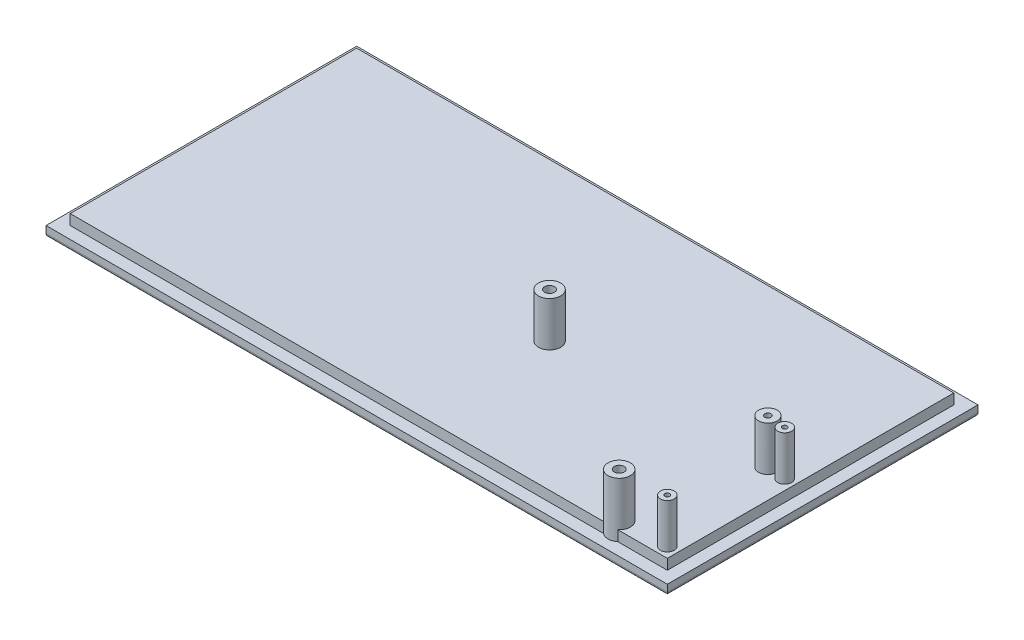
ISO-10303-21;
HEADER;
FILE_DESCRIPTION(('STEP AP214'),'2;1');
FILE_NAME('part.step','',(''),(''),'','','');
FILE_SCHEMA(('AUTOMOTIVE_DESIGN { 1 0 10303 214 1 1 1 1 }'));
ENDSEC;
DATA;
#1=APPLICATION_CONTEXT('core data for automotive mechanical design processes');
#2=APPLICATION_PROTOCOL_DEFINITION('international standard','automotive_design',2000,#1);
#3=PRODUCT_CONTEXT('',#1,'mechanical');
#4=PRODUCT('Part','Part','',(#3));
#5=PRODUCT_RELATED_PRODUCT_CATEGORY('part','',(#4));
#6=PRODUCT_DEFINITION_FORMATION('','',#4);
#7=PRODUCT_DEFINITION_CONTEXT('part definition',#1,'design');
#8=PRODUCT_DEFINITION('design','',#6,#7);
#9=PRODUCT_DEFINITION_SHAPE('','',#8);
#10=(LENGTH_UNIT() NAMED_UNIT(*) SI_UNIT(.MILLI.,.METRE.));
#11=(NAMED_UNIT(*) PLANE_ANGLE_UNIT() SI_UNIT($,.RADIAN.));
#12=(NAMED_UNIT(*) SI_UNIT($,.STERADIAN.) SOLID_ANGLE_UNIT());
#13=UNCERTAINTY_MEASURE_WITH_UNIT(LENGTH_MEASURE(1.E-05),#10,'distance_accuracy_value','');
#14=(GEOMETRIC_REPRESENTATION_CONTEXT(3) GLOBAL_UNCERTAINTY_ASSIGNED_CONTEXT((#13)) GLOBAL_UNIT_ASSIGNED_CONTEXT((#10,
#11,#12)) REPRESENTATION_CONTEXT('',''));
#15=CARTESIAN_POINT('',(0.,0.,0.));
#16=DIRECTION('',(0.,0.,1.));
#17=DIRECTION('',(1.,0.,0.));
#18=AXIS2_PLACEMENT_3D('',#15,#16,#17);
#19=CARTESIAN_POINT('',(-86.5,6.,41.5));
#20=DIRECTION('',(0.,0.,-1.));
#21=DIRECTION('',(-1.,0.,0.));
#22=AXIS2_PLACEMENT_3D('',#19,#20,#21);
#23=PLANE('',#22);
#24=DIRECTION('',(0.,-1.,0.));
#25=VECTOR('',#24,1.);
#26=CARTESIAN_POINT('',(72.1375777776576,28.0216781373065,41.5));
#27=LINE('',#26,#25);
#28=CARTESIAN_POINT('',(72.1375777776576,3.,41.5));
#29=VERTEX_POINT('',#28);
#30=CARTESIAN_POINT('',(72.1375777776576,6.,41.5));
#31=VERTEX_POINT('',#30);
#32=EDGE_CURVE('E56',#29,#31,#27,.F.);
#33=ORIENTED_EDGE('',*,*,#32,.F.);
#34=DIRECTION('',(1.,0.,0.));
#35=VECTOR('',#34,1.);
#36=CARTESIAN_POINT('',(-86.5,3.,41.5));
#37=LINE('',#36,#35);
#38=CARTESIAN_POINT('',(86.5,3.,41.5));
#39=VERTEX_POINT('',#38);
#40=EDGE_CURVE('E138',#29,#39,#37,.T.);
#41=ORIENTED_EDGE('',*,*,#40,.T.);
#42=DIRECTION('',(0.,-1.,0.));
#43=VECTOR('',#42,1.);
#44=CARTESIAN_POINT('',(86.5,6.,41.5));
#45=LINE('',#44,#43);
#46=CARTESIAN_POINT('',(86.5,6.,41.5));
#47=VERTEX_POINT('',#46);
#48=EDGE_CURVE('E172',#47,#39,#45,.T.);
#49=ORIENTED_EDGE('',*,*,#48,.F.);
#50=DIRECTION('',(1.,0.,0.));
#51=VECTOR('',#50,1.);
#52=CARTESIAN_POINT('',(-86.5,6.,41.5));
#53=LINE('',#52,#51);
#54=EDGE_CURVE('E140',#31,#47,#53,.T.);
#55=ORIENTED_EDGE('',*,*,#54,.F.);
#56=EDGE_LOOP('',(#33,#41,#49,#55));
#57=FACE_BOUND('',#56,.T.);
#58=ADVANCED_FACE('F41',(#57),#23,.F.);
#59=DIRECTION('',(0.,-1.,0.));
#60=VECTOR('',#59,1.);
#61=CARTESIAN_POINT('',(68.0264222223423,28.0216781373065,41.5));
#62=LINE('',#61,#60);
#63=CARTESIAN_POINT('',(68.0264222223423,6.,41.5));
#64=VERTEX_POINT('',#63);
#65=CARTESIAN_POINT('',(68.0264222223423,3.,41.5));
#66=VERTEX_POINT('',#65);
#67=EDGE_CURVE('E130',#64,#66,#62,.T.);
#68=ORIENTED_EDGE('',*,*,#67,.F.);
#69=CARTESIAN_POINT('',(-86.5,6.,41.5));
#70=VERTEX_POINT('',#69);
#71=EDGE_CURVE('E712',#70,#64,#53,.T.);
#72=ORIENTED_EDGE('',*,*,#71,.F.);
#73=DIRECTION('',(0.,-1.,0.));
#74=VECTOR('',#73,1.);
#75=CARTESIAN_POINT('',(-86.5,6.,41.5));
#76=LINE('',#75,#74);
#77=CARTESIAN_POINT('',(-86.5,3.,41.5));
#78=VERTEX_POINT('',#77);
#79=EDGE_CURVE('E163',#70,#78,#76,.T.);
#80=ORIENTED_EDGE('',*,*,#79,.T.);
#81=EDGE_CURVE('E63',#78,#66,#37,.T.);
#82=ORIENTED_EDGE('',*,*,#81,.T.);
#83=EDGE_LOOP('',(#68,#72,#80,#82));
#84=FACE_BOUND('',#83,.T.);
#85=ADVANCED_FACE('F279',(#84),#23,.F.);
#86=CARTESIAN_POINT('',(-90.,3.,-45.));
#87=DIRECTION('',(1.,0.,0.));
#88=DIRECTION('',(0.,0.,-1.));
#89=AXIS2_PLACEMENT_3D('',#86,#87,#88);
#90=PLANE('',#89);
#91=DIRECTION('',(0.,-1.,0.));
#92=VECTOR('',#91,1.);
#93=CARTESIAN_POINT('',(-90.,3.,-45.));
#94=LINE('',#93,#92);
#95=CARTESIAN_POINT('',(-90.,3.,-45.));
#96=VERTEX_POINT('',#95);
#97=CARTESIAN_POINT('',(-90.,1.,-45.));
#98=VERTEX_POINT('',#97);
#99=EDGE_CURVE('E185',#96,#98,#94,.T.);
#100=ORIENTED_EDGE('',*,*,#99,.T.);
#101=DIRECTION('',(0.,0.,1.));
#102=VECTOR('',#101,1.);
#103=CARTESIAN_POINT('',(-90.,1.,-45.));
#104=LINE('',#103,#102);
#105=CARTESIAN_POINT('',(-90.,1.,45.));
#106=VERTEX_POINT('',#105);
#107=EDGE_CURVE('E213',#98,#106,#104,.T.);
#108=ORIENTED_EDGE('',*,*,#107,.T.);
#109=DIRECTION('',(0.,-1.,0.));
#110=VECTOR('',#109,1.);
#111=CARTESIAN_POINT('',(-90.,3.,45.));
#112=LINE('',#111,#110);
#113=CARTESIAN_POINT('',(-90.,3.,45.));
#114=VERTEX_POINT('',#113);
#115=EDGE_CURVE('E194',#114,#106,#112,.T.);
#116=ORIENTED_EDGE('',*,*,#115,.F.);
#117=DIRECTION('',(0.,0.,1.));
#118=VECTOR('',#117,1.);
#119=CARTESIAN_POINT('',(-90.,3.,-45.));
#120=LINE('',#119,#118);
#121=EDGE_CURVE('E175',#96,#114,#120,.T.);
#122=ORIENTED_EDGE('',*,*,#121,.F.);
#123=EDGE_LOOP('',(#100,#108,#116,#122));
#124=FACE_BOUND('',#123,.T.);
#125=ADVANCED_FACE('F285',(#124),#90,.F.);
#126=CARTESIAN_POINT('',(-90.,3.,45.));
#127=DIRECTION('',(0.,0.,-1.));
#128=DIRECTION('',(-1.,0.,0.));
#129=AXIS2_PLACEMENT_3D('',#126,#127,#128);
#130=PLANE('',#129);
#131=ORIENTED_EDGE('',*,*,#115,.T.);
#132=DIRECTION('',(1.,0.,0.));
#133=VECTOR('',#132,1.);
#134=CARTESIAN_POINT('',(-90.,1.,45.));
#135=LINE('',#134,#133);
#136=CARTESIAN_POINT('',(90.,1.,45.));
#137=VERTEX_POINT('',#136);
#138=EDGE_CURVE('E197',#106,#137,#135,.T.);
#139=ORIENTED_EDGE('',*,*,#138,.T.);
#140=DIRECTION('',(0.,-1.,0.));
#141=VECTOR('',#140,1.);
#142=CARTESIAN_POINT('',(90.,3.,45.));
#143=LINE('',#142,#141);
#144=CARTESIAN_POINT('',(90.,3.,45.));
#145=VERTEX_POINT('',#144);
#146=EDGE_CURVE('E191',#145,#137,#143,.T.);
#147=ORIENTED_EDGE('',*,*,#146,.F.);
#148=DIRECTION('',(1.,0.,0.));
#149=VECTOR('',#148,1.);
#150=CARTESIAN_POINT('',(-90.,3.,45.));
#151=LINE('',#150,#149);
#152=EDGE_CURVE('E178',#114,#145,#151,.T.);
#153=ORIENTED_EDGE('',*,*,#152,.F.);
#154=EDGE_LOOP('',(#131,#139,#147,#153));
#155=FACE_BOUND('',#154,.T.);
#156=ADVANCED_FACE('F304',(#155),#130,.F.);
#157=CARTESIAN_POINT('',(90.,3.,-45.));
#158=DIRECTION('',(-1.,0.,0.));
#159=DIRECTION('',(0.,0.,1.));
#160=AXIS2_PLACEMENT_3D('',#157,#158,#159);
#161=PLANE('',#160);
#162=ORIENTED_EDGE('',*,*,#146,.T.);
#163=DIRECTION('',(0.,0.,-1.));
#164=VECTOR('',#163,1.);
#165=CARTESIAN_POINT('',(90.,1.,-45.));
#166=LINE('',#165,#164);
#167=CARTESIAN_POINT('',(90.,1.,-45.));
#168=VERTEX_POINT('',#167);
#169=EDGE_CURVE('E209',#137,#168,#166,.T.);
#170=ORIENTED_EDGE('',*,*,#169,.T.);
#171=DIRECTION('',(0.,-1.,0.));
#172=VECTOR('',#171,1.);
#173=CARTESIAN_POINT('',(90.,3.,-45.));
#174=LINE('',#173,#172);
#175=CARTESIAN_POINT('',(90.,3.,-45.));
#176=VERTEX_POINT('',#175);
#177=EDGE_CURVE('E188',#176,#168,#174,.T.);
#178=ORIENTED_EDGE('',*,*,#177,.F.);
#179=DIRECTION('',(0.,0.,-1.));
#180=VECTOR('',#179,1.);
#181=CARTESIAN_POINT('',(90.,3.,-45.));
#182=LINE('',#181,#180);
#183=EDGE_CURVE('E181',#145,#176,#182,.T.);
#184=ORIENTED_EDGE('',*,*,#183,.F.);
#185=EDGE_LOOP('',(#162,#170,#178,#184));
#186=FACE_BOUND('',#185,.T.);
#187=ADVANCED_FACE('F300',(#186),#161,.F.);
#188=CARTESIAN_POINT('',(-90.,3.,-45.));
#189=DIRECTION('',(0.,0.,1.));
#190=DIRECTION('',(1.,0.,0.));
#191=AXIS2_PLACEMENT_3D('',#188,#189,#190);
#192=PLANE('',#191);
#193=ORIENTED_EDGE('',*,*,#177,.T.);
#194=DIRECTION('',(-1.,0.,0.));
#195=VECTOR('',#194,1.);
#196=CARTESIAN_POINT('',(-90.,1.,-45.));
#197=LINE('',#196,#195);
#198=EDGE_CURVE('E211',#168,#98,#197,.T.);
#199=ORIENTED_EDGE('',*,*,#198,.T.);
#200=ORIENTED_EDGE('',*,*,#99,.F.);
#201=DIRECTION('',(-1.,0.,0.));
#202=VECTOR('',#201,1.);
#203=CARTESIAN_POINT('',(-90.,3.,-45.));
#204=LINE('',#203,#202);
#205=EDGE_CURVE('E183',#176,#96,#204,.T.);
#206=ORIENTED_EDGE('',*,*,#205,.F.);
#207=EDGE_LOOP('',(#193,#199,#200,#206));
#208=FACE_BOUND('',#207,.T.);
#209=ADVANCED_FACE('F294',(#208),#192,.F.);
#210=CARTESIAN_POINT('',(0.,3.,0.));
#211=DIRECTION('',(0.,1.,0.));
#212=DIRECTION('',(0.,0.,1.));
#213=AXIS2_PLACEMENT_3D('',#210,#211,#212);
#214=PLANE('',#213);
#215=ORIENTED_EDGE('',*,*,#40,.F.);
#216=CARTESIAN_POINT('',(70.082,3.,39.015));
#217=DIRECTION('',(0.,1.,0.));
#218=DIRECTION('',(0.,0.,1.));
#219=AXIS2_PLACEMENT_3D('',#216,#217,#218);
#220=CIRCLE('',#219,3.22500000000001);
#221=EDGE_CURVE('E127',#66,#29,#220,.T.);
#222=ORIENTED_EDGE('',*,*,#221,.F.);
#223=ORIENTED_EDGE('',*,*,#81,.F.);
#224=DIRECTION('',(0.,0.,1.));
#225=VECTOR('',#224,1.);
#226=CARTESIAN_POINT('',(-86.5,3.,-41.5));
#227=LINE('',#226,#225);
#228=CARTESIAN_POINT('',(-86.5,3.,-41.5));
#229=VERTEX_POINT('',#228);
#230=EDGE_CURVE('E161',#229,#78,#227,.T.);
#231=ORIENTED_EDGE('',*,*,#230,.F.);
#232=DIRECTION('',(-1.,0.,0.));
#233=VECTOR('',#232,1.);
#234=CARTESIAN_POINT('',(86.5,3.,-41.5));
#235=LINE('',#234,#233);
#236=CARTESIAN_POINT('',(86.5,3.,-41.5));
#237=VERTEX_POINT('',#236);
#238=EDGE_CURVE('E158',#237,#229,#235,.T.);
#239=ORIENTED_EDGE('',*,*,#238,.F.);
#240=DIRECTION('',(0.,0.,-1.));
#241=VECTOR('',#240,1.);
#242=CARTESIAN_POINT('',(86.5,3.,41.5));
#243=LINE('',#242,#241);
#244=EDGE_CURVE('E146',#39,#237,#243,.T.);
#245=ORIENTED_EDGE('',*,*,#244,.F.);
#246=EDGE_LOOP('',(#215,#222,#223,#231,#239,#245));
#247=FACE_BOUND('',#246,.T.);
#248=ORIENTED_EDGE('',*,*,#121,.T.);
#249=ORIENTED_EDGE('',*,*,#152,.T.);
#250=ORIENTED_EDGE('',*,*,#183,.T.);
#251=ORIENTED_EDGE('',*,*,#205,.T.);
#252=EDGE_LOOP('',(#248,#249,#250,#251));
#253=FACE_BOUND('',#252,.T.);
#254=ADVANCED_FACE('F143',(#247,#253),#214,.T.);
#255=CARTESIAN_POINT('',(0.,0.,0.));
#256=DIRECTION('',(0.,1.,0.));
#257=DIRECTION('',(0.,0.,1.));
#258=AXIS2_PLACEMENT_3D('',#255,#256,#257);
#259=PLANE('',#258);
#260=DIRECTION('',(0.,0.,-1.));
#261=VECTOR('',#260,1.);
#262=CARTESIAN_POINT('',(89.,0.,0.));
#263=LINE('',#262,#261);
#264=CARTESIAN_POINT('',(89.,0.,-44.));
#265=VERTEX_POINT('',#264);
#266=CARTESIAN_POINT('',(89.,0.,44.));
#267=VERTEX_POINT('',#266);
#268=EDGE_CURVE('E204',#265,#267,#263,.F.);
#269=ORIENTED_EDGE('',*,*,#268,.T.);
#270=DIRECTION('',(1.,0.,0.));
#271=VECTOR('',#270,1.);
#272=CARTESIAN_POINT('',(0.,0.,44.));
#273=LINE('',#272,#271);
#274=CARTESIAN_POINT('',(-89.,0.,44.));
#275=VERTEX_POINT('',#274);
#276=EDGE_CURVE('E206',#267,#275,#273,.F.);
#277=ORIENTED_EDGE('',*,*,#276,.T.);
#278=DIRECTION('',(0.,0.,1.));
#279=VECTOR('',#278,1.);
#280=CARTESIAN_POINT('',(-89.,0.,0.));
#281=LINE('',#280,#279);
#282=CARTESIAN_POINT('',(-89.,0.,-44.));
#283=VERTEX_POINT('',#282);
#284=EDGE_CURVE('E200',#275,#283,#281,.F.);
#285=ORIENTED_EDGE('',*,*,#284,.T.);
#286=DIRECTION('',(-1.,0.,0.));
#287=VECTOR('',#286,1.);
#288=CARTESIAN_POINT('',(0.,0.,-44.));
#289=LINE('',#288,#287);
#290=EDGE_CURVE('E202',#283,#265,#289,.F.);
#291=ORIENTED_EDGE('',*,*,#290,.T.);
#292=EDGE_LOOP('',(#269,#277,#285,#291));
#293=FACE_BOUND('',#292,.T.);
#294=ADVANCED_FACE('F293',(#293),#259,.F.);
#295=CARTESIAN_POINT('',(-90.,1.,-44.));
#296=DIRECTION('',(-1.,0.,0.));
#297=DIRECTION('',(0.,0.,1.));
#298=AXIS2_PLACEMENT_3D('',#295,#296,#297);
#299=CYLINDRICAL_SURFACE('',#298,1.);
#300=CARTESIAN_POINT('',(89.,1.,-44.));
#301=DIRECTION('',(-0.707106781186548,0.,-0.707106781186547));
#302=DIRECTION('',(-0.707106781186547,0.,0.707106781186548));
#303=AXIS2_PLACEMENT_3D('',#300,#301,#302);
#304=ELLIPSE('',#303,1.41421356237309,1.);
#305=EDGE_CURVE('E219',#265,#168,#304,.F.);
#306=ORIENTED_EDGE('',*,*,#305,.F.);
#307=ORIENTED_EDGE('',*,*,#290,.F.);
#308=CARTESIAN_POINT('',(-89.,1.,-44.));
#309=DIRECTION('',(-0.707106781186547,0.,0.707106781186548));
#310=DIRECTION('',(0.707106781186548,0.,0.707106781186547));
#311=AXIS2_PLACEMENT_3D('',#308,#309,#310);
#312=ELLIPSE('',#311,1.4142135623731,1.);
#313=EDGE_CURVE('E179',#98,#283,#312,.T.);
#314=ORIENTED_EDGE('',*,*,#313,.F.);
#315=ORIENTED_EDGE('',*,*,#198,.F.);
#316=EDGE_LOOP('',(#306,#307,#314,#315));
#317=FACE_BOUND('',#316,.T.);
#318=ADVANCED_FACE('F43',(#317),#299,.T.);
#319=CARTESIAN_POINT('',(-89.,1.,-45.));
#320=DIRECTION('',(0.,0.,1.));
#321=DIRECTION('',(1.,0.,0.));
#322=AXIS2_PLACEMENT_3D('',#319,#320,#321);
#323=CYLINDRICAL_SURFACE('',#322,1.);
#324=ORIENTED_EDGE('',*,*,#313,.T.);
#325=ORIENTED_EDGE('',*,*,#284,.F.);
#326=CARTESIAN_POINT('',(-89.,1.,44.));
#327=DIRECTION('',(0.707106781186548,0.,0.707106781186547));
#328=DIRECTION('',(-0.707106781186547,0.,0.707106781186548));
#329=AXIS2_PLACEMENT_3D('',#326,#327,#328);
#330=ELLIPSE('',#329,1.41421356237309,1.);
#331=EDGE_CURVE('E217',#106,#275,#330,.T.);
#332=ORIENTED_EDGE('',*,*,#331,.F.);
#333=ORIENTED_EDGE('',*,*,#107,.F.);
#334=EDGE_LOOP('',(#324,#325,#332,#333));
#335=FACE_BOUND('',#334,.T.);
#336=ADVANCED_FACE('F318',(#335),#323,.T.);
#337=CARTESIAN_POINT('',(89.,1.,-45.));
#338=DIRECTION('',(0.,0.,-1.));
#339=DIRECTION('',(-1.,0.,0.));
#340=AXIS2_PLACEMENT_3D('',#337,#338,#339);
#341=CYLINDRICAL_SURFACE('',#340,1.);
#342=ORIENTED_EDGE('',*,*,#305,.T.);
#343=ORIENTED_EDGE('',*,*,#169,.F.);
#344=CARTESIAN_POINT('',(89.,1.,44.));
#345=DIRECTION('',(0.707106781186547,0.,-0.707106781186548));
#346=DIRECTION('',(-0.707106781186548,0.,-0.707106781186547));
#347=AXIS2_PLACEMENT_3D('',#344,#345,#346);
#348=ELLIPSE('',#347,1.4142135623731,1.);
#349=EDGE_CURVE('E174',#267,#137,#348,.F.);
#350=ORIENTED_EDGE('',*,*,#349,.F.);
#351=ORIENTED_EDGE('',*,*,#268,.F.);
#352=EDGE_LOOP('',(#342,#343,#350,#351));
#353=FACE_BOUND('',#352,.T.);
#354=ADVANCED_FACE('F315',(#353),#341,.T.);
#355=CARTESIAN_POINT('',(-90.,1.,44.));
#356=DIRECTION('',(1.,0.,0.));
#357=DIRECTION('',(0.,0.,-1.));
#358=AXIS2_PLACEMENT_3D('',#355,#356,#357);
#359=CYLINDRICAL_SURFACE('',#358,1.);
#360=ORIENTED_EDGE('',*,*,#331,.T.);
#361=ORIENTED_EDGE('',*,*,#276,.F.);
#362=ORIENTED_EDGE('',*,*,#349,.T.);
#363=ORIENTED_EDGE('',*,*,#138,.F.);
#364=EDGE_LOOP('',(#360,#361,#362,#363));
#365=FACE_BOUND('',#364,.T.);
#366=ADVANCED_FACE('F312',(#365),#359,.T.);
#367=CARTESIAN_POINT('',(86.5,6.,41.5));
#368=DIRECTION('',(-1.,0.,0.));
#369=DIRECTION('',(0.,0.,1.));
#370=AXIS2_PLACEMENT_3D('',#367,#368,#369);
#371=PLANE('',#370);
#372=ORIENTED_EDGE('',*,*,#244,.T.);
#373=DIRECTION('',(0.,-1.,0.));
#374=VECTOR('',#373,1.);
#375=CARTESIAN_POINT('',(86.5,6.,-41.5));
#376=LINE('',#375,#374);
#377=CARTESIAN_POINT('',(86.5,6.,-41.5));
#378=VERTEX_POINT('',#377);
#379=EDGE_CURVE('E169',#378,#237,#376,.T.);
#380=ORIENTED_EDGE('',*,*,#379,.F.);
#381=DIRECTION('',(0.,0.,-1.));
#382=VECTOR('',#381,1.);
#383=CARTESIAN_POINT('',(86.5,6.,41.5));
#384=LINE('',#383,#382);
#385=EDGE_CURVE('E715',#47,#378,#384,.T.);
#386=ORIENTED_EDGE('',*,*,#385,.F.);
#387=ORIENTED_EDGE('',*,*,#48,.T.);
#388=EDGE_LOOP('',(#372,#380,#386,#387));
#389=FACE_BOUND('',#388,.T.);
#390=ADVANCED_FACE('F289',(#389),#371,.F.);
#391=CARTESIAN_POINT('',(86.5,6.,-41.5));
#392=DIRECTION('',(0.,0.,1.));
#393=DIRECTION('',(1.,0.,0.));
#394=AXIS2_PLACEMENT_3D('',#391,#392,#393);
#395=PLANE('',#394);
#396=ORIENTED_EDGE('',*,*,#238,.T.);
#397=DIRECTION('',(0.,-1.,0.));
#398=VECTOR('',#397,1.);
#399=CARTESIAN_POINT('',(-86.5,6.,-41.5));
#400=LINE('',#399,#398);
#401=CARTESIAN_POINT('',(-86.5,6.,-41.5));
#402=VERTEX_POINT('',#401);
#403=EDGE_CURVE('E166',#402,#229,#400,.T.);
#404=ORIENTED_EDGE('',*,*,#403,.F.);
#405=DIRECTION('',(-1.,0.,0.));
#406=VECTOR('',#405,1.);
#407=CARTESIAN_POINT('',(86.5,6.,-41.5));
#408=LINE('',#407,#406);
#409=EDGE_CURVE('E716',#378,#402,#408,.T.);
#410=ORIENTED_EDGE('',*,*,#409,.F.);
#411=ORIENTED_EDGE('',*,*,#379,.T.);
#412=EDGE_LOOP('',(#396,#404,#410,#411));
#413=FACE_BOUND('',#412,.T.);
#414=ADVANCED_FACE('F423',(#413),#395,.F.);
#415=CARTESIAN_POINT('',(-86.5,6.,-41.5));
#416=DIRECTION('',(1.,0.,0.));
#417=DIRECTION('',(0.,0.,-1.));
#418=AXIS2_PLACEMENT_3D('',#415,#416,#417);
#419=PLANE('',#418);
#420=ORIENTED_EDGE('',*,*,#230,.T.);
#421=ORIENTED_EDGE('',*,*,#79,.F.);
#422=DIRECTION('',(0.,0.,1.));
#423=VECTOR('',#422,1.);
#424=CARTESIAN_POINT('',(-86.5,6.,-41.5));
#425=LINE('',#424,#423);
#426=EDGE_CURVE('E155',#402,#70,#425,.T.);
#427=ORIENTED_EDGE('',*,*,#426,.F.);
#428=ORIENTED_EDGE('',*,*,#403,.T.);
#429=EDGE_LOOP('',(#420,#421,#427,#428));
#430=FACE_BOUND('',#429,.T.);
#431=ADVANCED_FACE('F275',(#430),#419,.F.);
#432=CARTESIAN_POINT('',(0.,6.,0.));
#433=DIRECTION('',(0.,1.,0.));
#434=DIRECTION('',(0.,0.,1.));
#435=AXIS2_PLACEMENT_3D('',#432,#433,#434);
#436=PLANE('',#435);
#437=CARTESIAN_POINT('',(14.882,6.,4.00499999999996));
#438=DIRECTION('',(0.,1.,0.));
#439=DIRECTION('',(0.,0.,1.));
#440=AXIS2_PLACEMENT_3D('',#437,#438,#439);
#441=CIRCLE('',#440,3.225);
#442=CARTESIAN_POINT('',(14.882,6.,7.22999999999996));
#443=VERTEX_POINT('',#442);
#444=EDGE_CURVE('E245',#443,#443,#441,.F.);
#445=ORIENTED_EDGE('',*,*,#444,.T.);
#446=EDGE_LOOP('',(#445));
#447=FACE_BOUND('',#446,.T.);
#448=CARTESIAN_POINT('',(78.142,6.,4.00499999999997));
#449=DIRECTION('',(0.,1.,0.));
#450=DIRECTION('',(0.,0.,1.));
#451=AXIS2_PLACEMENT_3D('',#448,#449,#450);
#452=CIRCLE('',#451,2.69499999999999);
#453=CARTESIAN_POINT('',(78.142,6.,6.69999999999996));
#454=VERTEX_POINT('',#453);
#455=EDGE_CURVE('E238',#454,#454,#452,.F.);
#456=ORIENTED_EDGE('',*,*,#455,.T.);
#457=EDGE_LOOP('',(#456));
#458=FACE_BOUND('',#457,.T.);
#459=CARTESIAN_POINT('',(83.5,6.,38.5));
#460=DIRECTION('',(0.,1.,0.));
#461=DIRECTION('',(0.,0.,1.));
#462=AXIS2_PLACEMENT_3D('',#459,#460,#461);
#463=CIRCLE('',#462,2.);
#464=CARTESIAN_POINT('',(83.5,6.,40.5));
#465=VERTEX_POINT('',#464);
#466=EDGE_CURVE('E230',#465,#465,#463,.F.);
#467=ORIENTED_EDGE('',*,*,#466,.T.);
#468=EDGE_LOOP('',(#467));
#469=FACE_BOUND('',#468,.T.);
#470=CARTESIAN_POINT('',(83.5,6.,4.49999999999997));
#471=DIRECTION('',(0.,1.,0.));
#472=DIRECTION('',(0.,0.,1.));
#473=AXIS2_PLACEMENT_3D('',#470,#471,#472);
#474=CIRCLE('',#473,2.);
#475=CARTESIAN_POINT('',(83.5,6.,6.49999999999997));
#476=VERTEX_POINT('',#475);
#477=EDGE_CURVE('E148',#476,#476,#474,.F.);
#478=ORIENTED_EDGE('',*,*,#477,.T.);
#479=EDGE_LOOP('',(#478));
#480=FACE_BOUND('',#479,.T.);
#481=ORIENTED_EDGE('',*,*,#71,.T.);
#482=CARTESIAN_POINT('',(70.082,6.,39.015));
#483=DIRECTION('',(0.,1.,0.));
#484=DIRECTION('',(0.,0.,1.));
#485=AXIS2_PLACEMENT_3D('',#482,#483,#484);
#486=CIRCLE('',#485,3.22500000000001);
#487=EDGE_CURVE('E11',#64,#31,#486,.F.);
#488=ORIENTED_EDGE('',*,*,#487,.T.);
#489=ORIENTED_EDGE('',*,*,#54,.T.);
#490=ORIENTED_EDGE('',*,*,#385,.T.);
#491=ORIENTED_EDGE('',*,*,#409,.T.);
#492=ORIENTED_EDGE('',*,*,#426,.T.);
#493=EDGE_LOOP('',(#481,#488,#489,#490,#491,#492));
#494=FACE_BOUND('',#493,.T.);
#495=ADVANCED_FACE('F260',(#447,#458,#469,#480,#494),#436,.T.);
#496=CARTESIAN_POINT('',(83.5,28.0216781373065,4.49999999999997));
#497=DIRECTION('',(0.,-1.,0.));
#498=DIRECTION('',(0.,0.,-1.));
#499=AXIS2_PLACEMENT_3D('',#496,#497,#498);
#500=CYLINDRICAL_SURFACE('',#499,2.);
#501=ORIENTED_EDGE('',*,*,#477,.F.);
#502=EDGE_LOOP('',(#501));
#503=FACE_BOUND('',#502,.T.);
#504=CARTESIAN_POINT('',(83.5,18.90000066,4.49999999999997));
#505=DIRECTION('',(0.,-1.,0.));
#506=DIRECTION('',(1.,0.,0.));
#507=AXIS2_PLACEMENT_3D('',#504,#505,#506);
#508=CIRCLE('',#507,2.);
#509=CARTESIAN_POINT('',(85.5,18.90000066,4.49999999999997));
#510=VERTEX_POINT('',#509);
#511=EDGE_CURVE('E233',#510,#510,#508,.T.);
#512=ORIENTED_EDGE('',*,*,#511,.T.);
#513=EDGE_LOOP('',(#512));
#514=FACE_BOUND('',#513,.T.);
#515=ADVANCED_FACE('F274',(#503,#514),#500,.T.);
#516=CARTESIAN_POINT('',(83.5,28.0216781373065,4.49999999999997));
#517=DIRECTION('',(0.,-1.,0.));
#518=DIRECTION('',(0.,0.,-1.));
#519=AXIS2_PLACEMENT_3D('',#516,#517,#518);
#520=CYLINDRICAL_SURFACE('',#519,0.699999999999987);
#521=CARTESIAN_POINT('',(83.5,6.,4.49999999999997));
#522=DIRECTION('',(0.,1.,0.));
#523=DIRECTION('',(0.,0.,1.));
#524=AXIS2_PLACEMENT_3D('',#521,#522,#523);
#525=CIRCLE('',#524,0.699999999999987);
#526=CARTESIAN_POINT('',(83.5,6.,5.19999999999996));
#527=VERTEX_POINT('',#526);
#528=EDGE_CURVE('E215',#527,#527,#525,.F.);
#529=ORIENTED_EDGE('',*,*,#528,.T.);
#530=EDGE_LOOP('',(#529));
#531=FACE_BOUND('',#530,.T.);
#532=CARTESIAN_POINT('',(83.5,18.90000066,4.49999999999997));
#533=DIRECTION('',(0.,-1.,0.));
#534=DIRECTION('',(1.,0.,0.));
#535=AXIS2_PLACEMENT_3D('',#532,#533,#534);
#536=CIRCLE('',#535,0.699999999999987);
#537=CARTESIAN_POINT('',(84.2,18.90000066,4.49999999999997));
#538=VERTEX_POINT('',#537);
#539=EDGE_CURVE('E151',#538,#538,#536,.T.);
#540=ORIENTED_EDGE('',*,*,#539,.F.);
#541=EDGE_LOOP('',(#540));
#542=FACE_BOUND('',#541,.T.);
#543=ADVANCED_FACE('F519',(#531,#542),#520,.F.);
#544=CARTESIAN_POINT('',(42.5,18.90000066,21.5));
#545=DIRECTION('',(0.,-1.,0.));
#546=DIRECTION('',(1.,0.,0.));
#547=AXIS2_PLACEMENT_3D('',#544,#545,#546);
#548=PLANE('',#547);
#549=ORIENTED_EDGE('',*,*,#539,.T.);
#550=EDGE_LOOP('',(#549));
#551=FACE_BOUND('',#550,.T.);
#552=ORIENTED_EDGE('',*,*,#511,.F.);
#553=EDGE_LOOP('',(#552));
#554=FACE_BOUND('',#553,.T.);
#555=ADVANCED_FACE('F454',(#551,#554),#548,.F.);
#556=ORIENTED_EDGE('',*,*,#528,.F.);
#557=EDGE_LOOP('',(#556));
#558=FACE_BOUND('',#557,.T.);
#559=ADVANCED_FACE('F277',(#558),#436,.T.);
#560=CARTESIAN_POINT('',(83.5,28.0216781373065,38.5));
#561=DIRECTION('',(0.,-1.,0.));
#562=DIRECTION('',(0.,0.,-1.));
#563=AXIS2_PLACEMENT_3D('',#560,#561,#562);
#564=CYLINDRICAL_SURFACE('',#563,2.);
#565=ORIENTED_EDGE('',*,*,#466,.F.);
#566=EDGE_LOOP('',(#565));
#567=FACE_BOUND('',#566,.T.);
#568=CARTESIAN_POINT('',(83.5,18.90000066,38.5));
#569=DIRECTION('',(0.,-1.,0.));
#570=DIRECTION('',(1.,0.,0.));
#571=AXIS2_PLACEMENT_3D('',#568,#569,#570);
#572=CIRCLE('',#571,2.);
#573=CARTESIAN_POINT('',(85.5,18.90000066,38.5));
#574=VERTEX_POINT('',#573);
#575=EDGE_CURVE('E234',#574,#574,#572,.T.);
#576=ORIENTED_EDGE('',*,*,#575,.T.);
#577=EDGE_LOOP('',(#576));
#578=FACE_BOUND('',#577,.T.);
#579=ADVANCED_FACE('F453',(#567,#578),#564,.T.);
#580=CARTESIAN_POINT('',(83.5,28.0216781373065,38.5));
#581=DIRECTION('',(0.,-1.,0.));
#582=DIRECTION('',(0.,0.,-1.));
#583=AXIS2_PLACEMENT_3D('',#580,#581,#582);
#584=CYLINDRICAL_SURFACE('',#583,0.699999999999988);
#585=CARTESIAN_POINT('',(83.5,6.,38.5));
#586=DIRECTION('',(0.,1.,0.));
#587=DIRECTION('',(0.,0.,1.));
#588=AXIS2_PLACEMENT_3D('',#585,#586,#587);
#589=CIRCLE('',#588,0.699999999999988);
#590=CARTESIAN_POINT('',(83.5,6.,39.2));
#591=VERTEX_POINT('',#590);
#592=EDGE_CURVE('E225',#591,#591,#589,.F.);
#593=ORIENTED_EDGE('',*,*,#592,.T.);
#594=EDGE_LOOP('',(#593));
#595=FACE_BOUND('',#594,.T.);
#596=CARTESIAN_POINT('',(83.5,18.90000066,38.5));
#597=DIRECTION('',(0.,-1.,0.));
#598=DIRECTION('',(1.,0.,0.));
#599=AXIS2_PLACEMENT_3D('',#596,#597,#598);
#600=CIRCLE('',#599,0.699999999999988);
#601=CARTESIAN_POINT('',(84.2,18.90000066,38.5));
#602=VERTEX_POINT('',#601);
#603=EDGE_CURVE('E241',#602,#602,#600,.T.);
#604=ORIENTED_EDGE('',*,*,#603,.F.);
#605=EDGE_LOOP('',(#604));
#606=FACE_BOUND('',#605,.T.);
#607=ADVANCED_FACE('F545',(#595,#606),#584,.F.);
#608=CARTESIAN_POINT('',(42.5,18.90000066,21.5));
#609=DIRECTION('',(0.,-1.,0.));
#610=DIRECTION('',(1.,0.,0.));
#611=AXIS2_PLACEMENT_3D('',#608,#609,#610);
#612=PLANE('',#611);
#613=ORIENTED_EDGE('',*,*,#603,.T.);
#614=EDGE_LOOP('',(#613));
#615=FACE_BOUND('',#614,.T.);
#616=ORIENTED_EDGE('',*,*,#575,.F.);
#617=EDGE_LOOP('',(#616));
#618=FACE_BOUND('',#617,.T.);
#619=ADVANCED_FACE('F468',(#615,#618),#612,.F.);
#620=ORIENTED_EDGE('',*,*,#592,.F.);
#621=EDGE_LOOP('',(#620));
#622=FACE_BOUND('',#621,.T.);
#623=ADVANCED_FACE('F456',(#622),#436,.T.);
#624=CARTESIAN_POINT('',(78.142,28.0216781373065,4.00499999999997));
#625=DIRECTION('',(0.,-1.,0.));
#626=DIRECTION('',(0.,0.,-1.));
#627=AXIS2_PLACEMENT_3D('',#624,#625,#626);
#628=CYLINDRICAL_SURFACE('',#627,2.69499999999999);
#629=ORIENTED_EDGE('',*,*,#455,.F.);
#630=EDGE_LOOP('',(#629));
#631=FACE_BOUND('',#630,.T.);
#632=CARTESIAN_POINT('',(78.142,18.90000066,4.00499999999997));
#633=DIRECTION('',(0.,-1.,0.));
#634=DIRECTION('',(1.,0.,0.));
#635=AXIS2_PLACEMENT_3D('',#632,#633,#634);
#636=CIRCLE('',#635,2.69499999999999);
#637=CARTESIAN_POINT('',(80.837,18.90000066,4.00499999999997));
#638=VERTEX_POINT('',#637);
#639=EDGE_CURVE('E242',#638,#638,#636,.T.);
#640=ORIENTED_EDGE('',*,*,#639,.T.);
#641=EDGE_LOOP('',(#640));
#642=FACE_BOUND('',#641,.T.);
#643=ADVANCED_FACE('F467',(#631,#642),#628,.T.);
#644=CARTESIAN_POINT('',(78.142,28.0216781373065,4.00499999999997));
#645=DIRECTION('',(0.,-1.,0.));
#646=DIRECTION('',(0.,0.,-1.));
#647=AXIS2_PLACEMENT_3D('',#644,#645,#646);
#648=CYLINDRICAL_SURFACE('',#647,0.894999999999998);
#649=CARTESIAN_POINT('',(78.142,6.,4.00499999999997));
#650=DIRECTION('',(0.,1.,0.));
#651=DIRECTION('',(0.,0.,1.));
#652=AXIS2_PLACEMENT_3D('',#649,#650,#651);
#653=CIRCLE('',#652,0.894999999999998);
#654=CARTESIAN_POINT('',(78.142,6.,4.89999999999996));
#655=VERTEX_POINT('',#654);
#656=EDGE_CURVE('E229',#655,#655,#653,.F.);
#657=ORIENTED_EDGE('',*,*,#656,.T.);
#658=EDGE_LOOP('',(#657));
#659=FACE_BOUND('',#658,.T.);
#660=CARTESIAN_POINT('',(78.142,18.90000066,4.00499999999997));
#661=DIRECTION('',(0.,-1.,0.));
#662=DIRECTION('',(1.,0.,0.));
#663=AXIS2_PLACEMENT_3D('',#660,#661,#662);
#664=CIRCLE('',#663,0.894999999999998);
#665=CARTESIAN_POINT('',(79.037,18.90000066,4.00499999999997));
#666=VERTEX_POINT('',#665);
#667=EDGE_CURVE('E247',#666,#666,#664,.T.);
#668=ORIENTED_EDGE('',*,*,#667,.F.);
#669=EDGE_LOOP('',(#668));
#670=FACE_BOUND('',#669,.T.);
#671=ADVANCED_FACE('F571',(#659,#670),#648,.F.);
#672=CARTESIAN_POINT('',(42.5,18.90000066,21.5));
#673=DIRECTION('',(0.,-1.,0.));
#674=DIRECTION('',(1.,0.,0.));
#675=AXIS2_PLACEMENT_3D('',#672,#673,#674);
#676=PLANE('',#675);
#677=ORIENTED_EDGE('',*,*,#667,.T.);
#678=EDGE_LOOP('',(#677));
#679=FACE_BOUND('',#678,.T.);
#680=ORIENTED_EDGE('',*,*,#639,.F.);
#681=EDGE_LOOP('',(#680));
#682=FACE_BOUND('',#681,.T.);
#683=ADVANCED_FACE('F481',(#679,#682),#676,.F.);
#684=ORIENTED_EDGE('',*,*,#656,.F.);
#685=EDGE_LOOP('',(#684));
#686=FACE_BOUND('',#685,.T.);
#687=ADVANCED_FACE('F272',(#686),#436,.T.);
#688=CARTESIAN_POINT('',(14.882,28.0216781373065,4.00499999999996));
#689=DIRECTION('',(0.,-1.,0.));
#690=DIRECTION('',(0.,0.,-1.));
#691=AXIS2_PLACEMENT_3D('',#688,#689,#690);
#692=CYLINDRICAL_SURFACE('',#691,3.225);
#693=ORIENTED_EDGE('',*,*,#444,.F.);
#694=EDGE_LOOP('',(#693));
#695=FACE_BOUND('',#694,.T.);
#696=CARTESIAN_POINT('',(14.882,18.90000066,4.00499999999996));
#697=DIRECTION('',(0.,-1.,0.));
#698=DIRECTION('',(1.,0.,0.));
#699=AXIS2_PLACEMENT_3D('',#696,#697,#698);
#700=CIRCLE('',#699,3.225);
#701=CARTESIAN_POINT('',(18.107,18.90000066,4.00499999999996));
#702=VERTEX_POINT('',#701);
#703=EDGE_CURVE('E248',#702,#702,#700,.T.);
#704=ORIENTED_EDGE('',*,*,#703,.T.);
#705=EDGE_LOOP('',(#704));
#706=FACE_BOUND('',#705,.T.);
#707=ADVANCED_FACE('F480',(#695,#706),#692,.T.);
#708=CARTESIAN_POINT('',(14.882,28.0216781373065,4.00499999999996));
#709=DIRECTION('',(0.,-1.,0.));
#710=DIRECTION('',(0.,0.,-1.));
#711=AXIS2_PLACEMENT_3D('',#708,#709,#710);
#712=CYLINDRICAL_SURFACE('',#711,1.425);
#713=CARTESIAN_POINT('',(14.882,6.,4.00499999999996));
#714=DIRECTION('',(0.,1.,0.));
#715=DIRECTION('',(0.,0.,1.));
#716=AXIS2_PLACEMENT_3D('',#713,#714,#715);
#717=CIRCLE('',#716,1.425);
#718=CARTESIAN_POINT('',(14.882,6.,5.42999999999996));
#719=VERTEX_POINT('',#718);
#720=EDGE_CURVE('E237',#719,#719,#717,.F.);
#721=ORIENTED_EDGE('',*,*,#720,.T.);
#722=EDGE_LOOP('',(#721));
#723=FACE_BOUND('',#722,.T.);
#724=CARTESIAN_POINT('',(14.882,18.90000066,4.00499999999996));
#725=DIRECTION('',(0.,-1.,0.));
#726=DIRECTION('',(1.,0.,0.));
#727=AXIS2_PLACEMENT_3D('',#724,#725,#726);
#728=CIRCLE('',#727,1.425);
#729=CARTESIAN_POINT('',(16.307,18.90000066,4.00499999999996));
#730=VERTEX_POINT('',#729);
#731=EDGE_CURVE('E141',#730,#730,#728,.T.);
#732=ORIENTED_EDGE('',*,*,#731,.F.);
#733=EDGE_LOOP('',(#732));
#734=FACE_BOUND('',#733,.T.);
#735=ADVANCED_FACE('F597',(#723,#734),#712,.F.);
#736=CARTESIAN_POINT('',(42.5,18.90000066,21.5));
#737=DIRECTION('',(0.,-1.,0.));
#738=DIRECTION('',(1.,0.,0.));
#739=AXIS2_PLACEMENT_3D('',#736,#737,#738);
#740=PLANE('',#739);
#741=ORIENTED_EDGE('',*,*,#731,.T.);
#742=EDGE_LOOP('',(#741));
#743=FACE_BOUND('',#742,.T.);
#744=ORIENTED_EDGE('',*,*,#703,.F.);
#745=EDGE_LOOP('',(#744));
#746=FACE_BOUND('',#745,.T.);
#747=ADVANCED_FACE('F270',(#743,#746),#740,.F.);
#748=ORIENTED_EDGE('',*,*,#720,.F.);
#749=EDGE_LOOP('',(#748));
#750=FACE_BOUND('',#749,.T.);
#751=ADVANCED_FACE('F259',(#750),#436,.T.);
#752=CARTESIAN_POINT('',(70.082,28.0216781373065,39.015));
#753=DIRECTION('',(0.,-1.,0.));
#754=DIRECTION('',(0.,0.,-1.));
#755=AXIS2_PLACEMENT_3D('',#752,#753,#754);
#756=CYLINDRICAL_SURFACE('',#755,3.22500000000001);
#757=CARTESIAN_POINT('',(70.082,18.90000066,39.015));
#758=DIRECTION('',(0.,-1.,0.));
#759=DIRECTION('',(1.,0.,0.));
#760=AXIS2_PLACEMENT_3D('',#757,#758,#759);
#761=CIRCLE('',#760,3.22500000000001);
#762=CARTESIAN_POINT('',(73.307,18.90000066,39.015));
#763=VERTEX_POINT('',#762);
#764=EDGE_CURVE('E132',#763,#763,#761,.T.);
#765=ORIENTED_EDGE('',*,*,#764,.T.);
#766=EDGE_LOOP('',(#765));
#767=FACE_BOUND('',#766,.T.);
#768=ORIENTED_EDGE('',*,*,#221,.T.);
#769=ORIENTED_EDGE('',*,*,#32,.T.);
#770=ORIENTED_EDGE('',*,*,#487,.F.);
#771=ORIENTED_EDGE('',*,*,#67,.T.);
#772=EDGE_LOOP('',(#768,#769,#770,#771));
#773=FACE_BOUND('',#772,.T.);
#774=ADVANCED_FACE('F128',(#767,#773),#756,.T.);
#775=CARTESIAN_POINT('',(70.082,28.0216781373065,39.015));
#776=DIRECTION('',(0.,-1.,0.));
#777=DIRECTION('',(0.,0.,-1.));
#778=AXIS2_PLACEMENT_3D('',#775,#776,#777);
#779=CYLINDRICAL_SURFACE('',#778,1.425);
#780=CARTESIAN_POINT('',(70.082,6.,39.015));
#781=DIRECTION('',(0.,1.,0.));
#782=DIRECTION('',(0.,0.,1.));
#783=AXIS2_PLACEMENT_3D('',#780,#781,#782);
#784=CIRCLE('',#783,1.425);
#785=CARTESIAN_POINT('',(70.082,6.,40.44));
#786=VERTEX_POINT('',#785);
#787=EDGE_CURVE('E49',#786,#786,#784,.F.);
#788=ORIENTED_EDGE('',*,*,#787,.T.);
#789=EDGE_LOOP('',(#788));
#790=FACE_BOUND('',#789,.T.);
#791=CARTESIAN_POINT('',(70.082,18.90000066,39.015));
#792=DIRECTION('',(0.,-1.,0.));
#793=DIRECTION('',(1.,0.,0.));
#794=AXIS2_PLACEMENT_3D('',#791,#792,#793);
#795=CIRCLE('',#794,1.425);
#796=CARTESIAN_POINT('',(71.507,18.90000066,39.015));
#797=VERTEX_POINT('',#796);
#798=EDGE_CURVE('E133',#797,#797,#795,.T.);
#799=ORIENTED_EDGE('',*,*,#798,.F.);
#800=EDGE_LOOP('',(#799));
#801=FACE_BOUND('',#800,.T.);
#802=ADVANCED_FACE('F252',(#790,#801),#779,.F.);
#803=CARTESIAN_POINT('',(42.5,18.90000066,21.5));
#804=DIRECTION('',(0.,-1.,0.));
#805=DIRECTION('',(1.,0.,0.));
#806=AXIS2_PLACEMENT_3D('',#803,#804,#805);
#807=PLANE('',#806);
#808=ORIENTED_EDGE('',*,*,#798,.T.);
#809=EDGE_LOOP('',(#808));
#810=FACE_BOUND('',#809,.T.);
#811=ORIENTED_EDGE('',*,*,#764,.F.);
#812=EDGE_LOOP('',(#811));
#813=FACE_BOUND('',#812,.T.);
#814=ADVANCED_FACE('F257',(#810,#813),#807,.F.);
#815=ORIENTED_EDGE('',*,*,#787,.F.);
#816=EDGE_LOOP('',(#815));
#817=FACE_BOUND('',#816,.T.);
#818=ADVANCED_FACE('F255',(#817),#436,.T.);
#819=CLOSED_SHELL('',(#58,#85,#125,#156,#187,#209,#254,#294,#318,#336,#354,#366,#390,#414,#431,
#495,#515,#543,#555,#559,#579,#607,#619,#623,#643,#671,#683,#687,#707,#735,#747,#751,#774,#802,
#814,#818));
#820=MANIFOLD_SOLID_BREP('B2',#819);
#821=ADVANCED_BREP_SHAPE_REPRESENTATION('',(#18,#820),#14);
#822=SHAPE_DEFINITION_REPRESENTATION(#9,#821);
ENDSEC;
END-ISO-10303-21;
